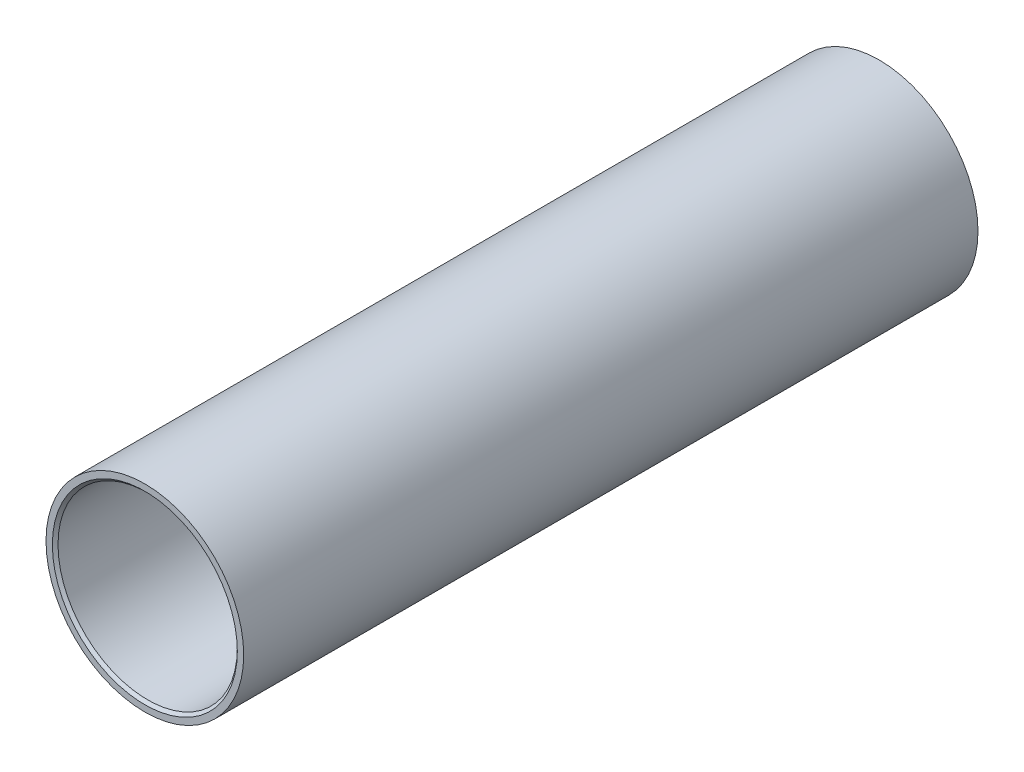
ISO-10303-21;
HEADER;
FILE_DESCRIPTION(('STEP AP214'),'2;1');
FILE_NAME('part.step','',(''),(''),'','','');
FILE_SCHEMA(('AUTOMOTIVE_DESIGN { 1 0 10303 214 1 1 1 1 }'));
ENDSEC;
DATA;
#1=APPLICATION_CONTEXT('core data for automotive mechanical design processes');
#2=APPLICATION_PROTOCOL_DEFINITION('international standard','automotive_design',2000,#1);
#3=PRODUCT_CONTEXT('',#1,'mechanical');
#4=PRODUCT('Part','Part','',(#3));
#5=PRODUCT_RELATED_PRODUCT_CATEGORY('part','',(#4));
#6=PRODUCT_DEFINITION_FORMATION('','',#4);
#7=PRODUCT_DEFINITION_CONTEXT('part definition',#1,'design');
#8=PRODUCT_DEFINITION('design','',#6,#7);
#9=PRODUCT_DEFINITION_SHAPE('','',#8);
#10=(LENGTH_UNIT() NAMED_UNIT(*) SI_UNIT(.MILLI.,.METRE.));
#11=(NAMED_UNIT(*) PLANE_ANGLE_UNIT() SI_UNIT($,.RADIAN.));
#12=(NAMED_UNIT(*) SI_UNIT($,.STERADIAN.) SOLID_ANGLE_UNIT());
#13=UNCERTAINTY_MEASURE_WITH_UNIT(LENGTH_MEASURE(1.E-05),#10,'distance_accuracy_value','');
#14=(GEOMETRIC_REPRESENTATION_CONTEXT(3) GLOBAL_UNCERTAINTY_ASSIGNED_CONTEXT((#13)) GLOBAL_UNIT_ASSIGNED_CONTEXT((#10,
#11,#12)) REPRESENTATION_CONTEXT('',''));
#15=CARTESIAN_POINT('',(0.,0.,0.));
#16=DIRECTION('',(0.,0.,1.));
#17=DIRECTION('',(1.,0.,0.));
#18=AXIS2_PLACEMENT_3D('',#15,#16,#17);
#19=CARTESIAN_POINT('',(0.,0.,520.));
#20=DIRECTION('',(0.,0.,1.));
#21=DIRECTION('',(1.,0.,0.));
#22=AXIS2_PLACEMENT_3D('',#19,#20,#21);
#23=PLANE('',#22);
#24=CARTESIAN_POINT('',(0.,0.,520.));
#25=DIRECTION('',(0.,0.,1.));
#26=DIRECTION('',(1.,0.,0.));
#27=AXIS2_PLACEMENT_3D('',#24,#25,#26);
#28=CIRCLE('',#27,65.4999999999999);
#29=CARTESIAN_POINT('',(65.4999999999999,0.,520.));
#30=VERTEX_POINT('',#29);
#31=EDGE_CURVE('E10',#30,#30,#28,.F.);
#32=ORIENTED_EDGE('',*,*,#31,.T.);
#33=EDGE_LOOP('',(#32));
#34=FACE_BOUND('',#33,.T.);
#35=CARTESIAN_POINT('',(0.,0.,520.));
#36=DIRECTION('',(0.,0.,1.));
#37=DIRECTION('',(1.,0.,0.));
#38=AXIS2_PLACEMENT_3D('',#35,#36,#37);
#39=CIRCLE('',#38,70.);
#40=CARTESIAN_POINT('',(70.,0.,520.));
#41=VERTEX_POINT('',#40);
#42=EDGE_CURVE('E55',#41,#41,#39,.T.);
#43=ORIENTED_EDGE('',*,*,#42,.T.);
#44=EDGE_LOOP('',(#43));
#45=FACE_BOUND('',#44,.T.);
#46=ADVANCED_FACE('F34',(#34,#45),#23,.T.);
#47=CARTESIAN_POINT('',(0.,0.,0.));
#48=DIRECTION('',(0.,0.,1.));
#49=DIRECTION('',(1.,0.,0.));
#50=AXIS2_PLACEMENT_3D('',#47,#48,#49);
#51=PLANE('',#50);
#52=CARTESIAN_POINT('',(0.,0.,0.));
#53=DIRECTION('',(0.,0.,1.));
#54=DIRECTION('',(1.,0.,0.));
#55=AXIS2_PLACEMENT_3D('',#52,#53,#54);
#56=CIRCLE('',#55,65.5);
#57=CARTESIAN_POINT('',(65.5,0.,0.));
#58=VERTEX_POINT('',#57);
#59=EDGE_CURVE('E50',#58,#58,#56,.T.);
#60=ORIENTED_EDGE('',*,*,#59,.T.);
#61=EDGE_LOOP('',(#60));
#62=FACE_BOUND('',#61,.T.);
#63=CARTESIAN_POINT('',(0.,0.,0.));
#64=DIRECTION('',(0.,0.,1.));
#65=DIRECTION('',(1.,0.,0.));
#66=AXIS2_PLACEMENT_3D('',#63,#64,#65);
#67=CIRCLE('',#66,70.);
#68=CARTESIAN_POINT('',(70.,0.,0.));
#69=VERTEX_POINT('',#68);
#70=EDGE_CURVE('E56',#69,#69,#67,.T.);
#71=ORIENTED_EDGE('',*,*,#70,.F.);
#72=EDGE_LOOP('',(#71));
#73=FACE_BOUND('',#72,.T.);
#74=ADVANCED_FACE('F67',(#62,#73),#51,.F.);
#75=CARTESIAN_POINT('',(0.,0.,520.));
#76=DIRECTION('',(0.,0.,-1.));
#77=DIRECTION('',(-1.,0.,0.));
#78=AXIS2_PLACEMENT_3D('',#75,#76,#77);
#79=CYLINDRICAL_SURFACE('',#78,70.);
#80=ORIENTED_EDGE('',*,*,#42,.F.);
#81=EDGE_LOOP('',(#80));
#82=FACE_BOUND('',#81,.T.);
#83=ORIENTED_EDGE('',*,*,#70,.T.);
#84=EDGE_LOOP('',(#83));
#85=FACE_BOUND('',#84,.T.);
#86=ADVANCED_FACE('F63',(#82,#85),#79,.T.);
#87=CARTESIAN_POINT('',(0.,0.,520.));
#88=DIRECTION('',(0.,0.,-1.));
#89=DIRECTION('',(-1.,0.,0.));
#90=AXIS2_PLACEMENT_3D('',#87,#88,#89);
#91=CYLINDRICAL_SURFACE('',#90,63.5);
#92=CARTESIAN_POINT('',(0.,0.,2.));
#93=DIRECTION('',(0.,0.,1.));
#94=DIRECTION('',(1.,0.,0.));
#95=AXIS2_PLACEMENT_3D('',#92,#93,#94);
#96=CIRCLE('',#95,63.5);
#97=CARTESIAN_POINT('',(63.5,0.,2.));
#98=VERTEX_POINT('',#97);
#99=EDGE_CURVE('E42',#98,#98,#96,.F.);
#100=ORIENTED_EDGE('',*,*,#99,.T.);
#101=EDGE_LOOP('',(#100));
#102=FACE_BOUND('',#101,.T.);
#103=CARTESIAN_POINT('',(0.,0.,518.));
#104=DIRECTION('',(0.,0.,1.));
#105=DIRECTION('',(1.,0.,0.));
#106=AXIS2_PLACEMENT_3D('',#103,#104,#105);
#107=CIRCLE('',#106,63.5);
#108=CARTESIAN_POINT('',(63.5,0.,518.));
#109=VERTEX_POINT('',#108);
#110=EDGE_CURVE('E46',#109,#109,#107,.T.);
#111=ORIENTED_EDGE('',*,*,#110,.T.);
#112=EDGE_LOOP('',(#111));
#113=FACE_BOUND('',#112,.T.);
#114=ADVANCED_FACE('F66',(#102,#113),#91,.F.);
#115=CARTESIAN_POINT('',(0.,0.,0.));
#116=DIRECTION('',(0.,0.,-1.));
#117=DIRECTION('',(-1.,0.,0.));
#118=AXIS2_PLACEMENT_3D('',#115,#116,#117);
#119=CONICAL_SURFACE('',#118,65.5,0.785398163397448);
#120=ORIENTED_EDGE('',*,*,#99,.F.);
#121=EDGE_LOOP('',(#120));
#122=FACE_BOUND('',#121,.T.);
#123=ORIENTED_EDGE('',*,*,#59,.F.);
#124=EDGE_LOOP('',(#123));
#125=FACE_BOUND('',#124,.T.);
#126=ADVANCED_FACE('F80',(#122,#125),#119,.F.);
#127=CARTESIAN_POINT('',(0.,0.,518.));
#128=DIRECTION('',(0.,0.,1.));
#129=DIRECTION('',(1.,0.,0.));
#130=AXIS2_PLACEMENT_3D('',#127,#128,#129);
#131=CONICAL_SURFACE('',#130,63.5,0.785398163397435);
#132=ORIENTED_EDGE('',*,*,#31,.F.);
#133=EDGE_LOOP('',(#132));
#134=FACE_BOUND('',#133,.T.);
#135=ORIENTED_EDGE('',*,*,#110,.F.);
#136=EDGE_LOOP('',(#135));
#137=FACE_BOUND('',#136,.T.);
#138=ADVANCED_FACE('F37',(#134,#137),#131,.F.);
#139=CLOSED_SHELL('',(#46,#74,#86,#114,#126,#138));
#140=MANIFOLD_SOLID_BREP('B2',#139);
#141=ADVANCED_BREP_SHAPE_REPRESENTATION('',(#18,#140),#14);
#142=SHAPE_DEFINITION_REPRESENTATION(#9,#141);
ENDSEC;
END-ISO-10303-21;
